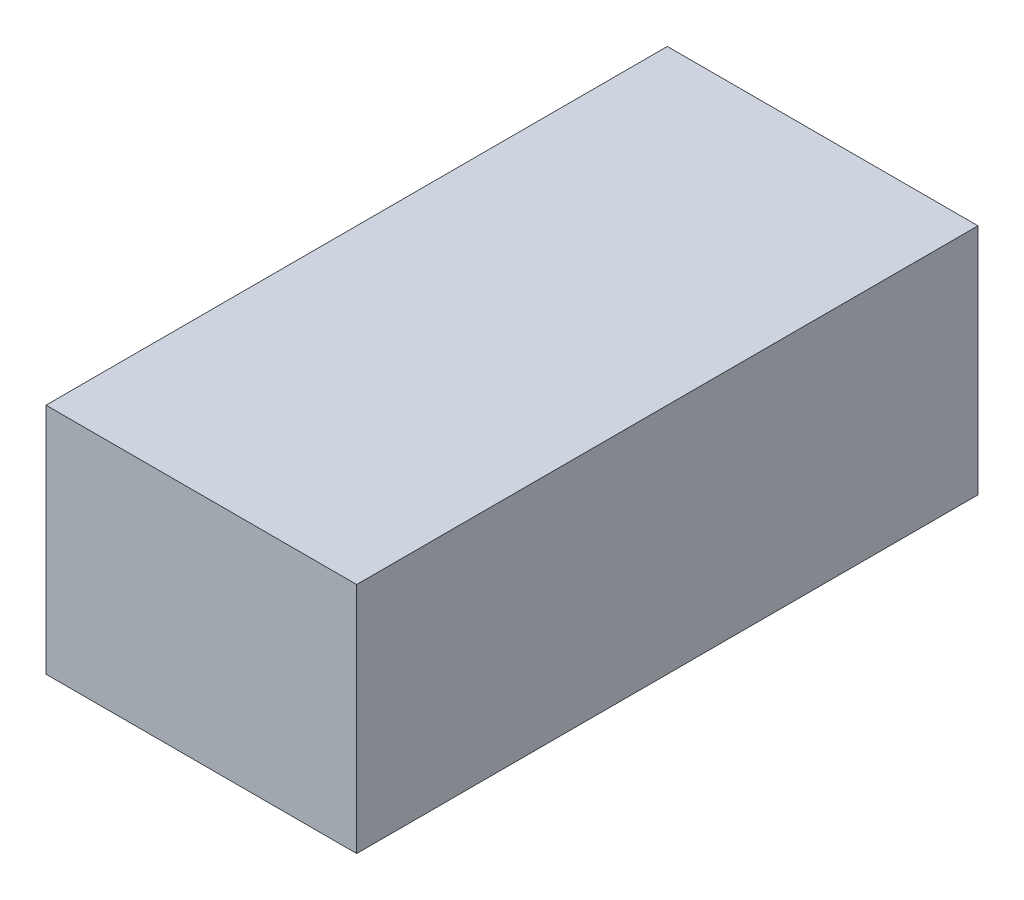
ISO-10303-21;
HEADER;
FILE_DESCRIPTION(('STEP AP214'),'2;1');
FILE_NAME('part.step','',(''),(''),'','','');
FILE_SCHEMA(('AUTOMOTIVE_DESIGN { 1 0 10303 214 1 1 1 1 }'));
ENDSEC;
DATA;
#1=APPLICATION_CONTEXT('core data for automotive mechanical design processes');
#2=APPLICATION_PROTOCOL_DEFINITION('international standard','automotive_design',2000,#1);
#3=PRODUCT_CONTEXT('',#1,'mechanical');
#4=PRODUCT('Part','Part','',(#3));
#5=PRODUCT_RELATED_PRODUCT_CATEGORY('part','',(#4));
#6=PRODUCT_DEFINITION_FORMATION('','',#4);
#7=PRODUCT_DEFINITION_CONTEXT('part definition',#1,'design');
#8=PRODUCT_DEFINITION('design','',#6,#7);
#9=PRODUCT_DEFINITION_SHAPE('','',#8);
#10=(LENGTH_UNIT() NAMED_UNIT(*) SI_UNIT(.MILLI.,.METRE.));
#11=(NAMED_UNIT(*) PLANE_ANGLE_UNIT() SI_UNIT($,.RADIAN.));
#12=(NAMED_UNIT(*) SI_UNIT($,.STERADIAN.) SOLID_ANGLE_UNIT());
#13=UNCERTAINTY_MEASURE_WITH_UNIT(LENGTH_MEASURE(1.E-05),#10,'distance_accuracy_value','');
#14=(GEOMETRIC_REPRESENTATION_CONTEXT(3) GLOBAL_UNCERTAINTY_ASSIGNED_CONTEXT((#13)) GLOBAL_UNIT_ASSIGNED_CONTEXT((#10,
#11,#12)) REPRESENTATION_CONTEXT('',''));
#15=CARTESIAN_POINT('',(0.,0.,0.));
#16=DIRECTION('',(0.,0.,1.));
#17=DIRECTION('',(1.,0.,0.));
#18=AXIS2_PLACEMENT_3D('',#15,#16,#17);
#19=CARTESIAN_POINT('',(50.,75.,-100.));
#20=DIRECTION('',(-1.,0.,0.));
#21=DIRECTION('',(0.,0.,1.));
#22=AXIS2_PLACEMENT_3D('',#19,#20,#21);
#23=PLANE('',#22);
#24=DIRECTION('',(0.,0.,-1.));
#25=VECTOR('',#24,1.);
#26=CARTESIAN_POINT('',(50.,0.,-100.));
#27=LINE('',#26,#25);
#28=CARTESIAN_POINT('',(50.,0.,100.));
#29=VERTEX_POINT('',#28);
#30=CARTESIAN_POINT('',(50.,0.,-100.));
#31=VERTEX_POINT('',#30);
#32=EDGE_CURVE('E108',#29,#31,#27,.T.);
#33=ORIENTED_EDGE('',*,*,#32,.T.);
#34=DIRECTION('',(0.,-1.,0.));
#35=VECTOR('',#34,1.);
#36=CARTESIAN_POINT('',(50.,75.,-100.));
#37=LINE('',#36,#35);
#38=CARTESIAN_POINT('',(50.,75.,-100.));
#39=VERTEX_POINT('',#38);
#40=EDGE_CURVE('E11',#39,#31,#37,.T.);
#41=ORIENTED_EDGE('',*,*,#40,.F.);
#42=DIRECTION('',(0.,0.,-1.));
#43=VECTOR('',#42,1.);
#44=CARTESIAN_POINT('',(50.,75.,-100.));
#45=LINE('',#44,#43);
#46=CARTESIAN_POINT('',(50.,75.,100.));
#47=VERTEX_POINT('',#46);
#48=EDGE_CURVE('E96',#47,#39,#45,.T.);
#49=ORIENTED_EDGE('',*,*,#48,.F.);
#50=DIRECTION('',(0.,-1.,0.));
#51=VECTOR('',#50,1.);
#52=CARTESIAN_POINT('',(50.,75.,100.));
#53=LINE('',#52,#51);
#54=EDGE_CURVE('E104',#47,#29,#53,.T.);
#55=ORIENTED_EDGE('',*,*,#54,.T.);
#56=EDGE_LOOP('',(#33,#41,#49,#55));
#57=FACE_BOUND('',#56,.T.);
#58=ADVANCED_FACE('F45',(#57),#23,.F.);
#59=CARTESIAN_POINT('',(-50.,75.,-100.));
#60=DIRECTION('',(0.,0.,1.));
#61=DIRECTION('',(1.,0.,0.));
#62=AXIS2_PLACEMENT_3D('',#59,#60,#61);
#63=PLANE('',#62);
#64=DIRECTION('',(-1.,0.,0.));
#65=VECTOR('',#64,1.);
#66=CARTESIAN_POINT('',(-50.,0.,-100.));
#67=LINE('',#66,#65);
#68=CARTESIAN_POINT('',(-50.,0.,-100.));
#69=VERTEX_POINT('',#68);
#70=EDGE_CURVE('E100',#31,#69,#67,.T.);
#71=ORIENTED_EDGE('',*,*,#70,.T.);
#72=DIRECTION('',(0.,-1.,0.));
#73=VECTOR('',#72,1.);
#74=CARTESIAN_POINT('',(-50.,75.,-100.));
#75=LINE('',#74,#73);
#76=CARTESIAN_POINT('',(-50.,75.,-100.));
#77=VERTEX_POINT('',#76);
#78=EDGE_CURVE('E53',#77,#69,#75,.T.);
#79=ORIENTED_EDGE('',*,*,#78,.F.);
#80=DIRECTION('',(-1.,0.,0.));
#81=VECTOR('',#80,1.);
#82=CARTESIAN_POINT('',(-50.,75.,-100.));
#83=LINE('',#82,#81);
#84=EDGE_CURVE('E91',#39,#77,#83,.T.);
#85=ORIENTED_EDGE('',*,*,#84,.F.);
#86=ORIENTED_EDGE('',*,*,#40,.T.);
#87=EDGE_LOOP('',(#71,#79,#85,#86));
#88=FACE_BOUND('',#87,.T.);
#89=ADVANCED_FACE('F99',(#88),#63,.F.);
#90=CARTESIAN_POINT('',(-50.,75.,-100.));
#91=DIRECTION('',(1.,0.,0.));
#92=DIRECTION('',(0.,0.,-1.));
#93=AXIS2_PLACEMENT_3D('',#90,#91,#92);
#94=PLANE('',#93);
#95=DIRECTION('',(0.,0.,1.));
#96=VECTOR('',#95,1.);
#97=CARTESIAN_POINT('',(-50.,0.,-100.));
#98=LINE('',#97,#96);
#99=CARTESIAN_POINT('',(-50.,0.,100.));
#100=VERTEX_POINT('',#99);
#101=EDGE_CURVE('E78',#69,#100,#98,.T.);
#102=ORIENTED_EDGE('',*,*,#101,.T.);
#103=DIRECTION('',(0.,-1.,0.));
#104=VECTOR('',#103,1.);
#105=CARTESIAN_POINT('',(-50.,75.,100.));
#106=LINE('',#105,#104);
#107=CARTESIAN_POINT('',(-50.,75.,100.));
#108=VERTEX_POINT('',#107);
#109=EDGE_CURVE('E101',#108,#100,#106,.T.);
#110=ORIENTED_EDGE('',*,*,#109,.F.);
#111=DIRECTION('',(0.,0.,1.));
#112=VECTOR('',#111,1.);
#113=CARTESIAN_POINT('',(-50.,75.,-100.));
#114=LINE('',#113,#112);
#115=EDGE_CURVE('E94',#77,#108,#114,.T.);
#116=ORIENTED_EDGE('',*,*,#115,.F.);
#117=ORIENTED_EDGE('',*,*,#78,.T.);
#118=EDGE_LOOP('',(#102,#110,#116,#117));
#119=FACE_BOUND('',#118,.T.);
#120=ADVANCED_FACE('F102',(#119),#94,.F.);
#121=CARTESIAN_POINT('',(-50.,75.,100.));
#122=DIRECTION('',(0.,0.,-1.));
#123=DIRECTION('',(-1.,0.,0.));
#124=AXIS2_PLACEMENT_3D('',#121,#122,#123);
#125=PLANE('',#124);
#126=DIRECTION('',(1.,0.,0.));
#127=VECTOR('',#126,1.);
#128=CARTESIAN_POINT('',(-50.,0.,100.));
#129=LINE('',#128,#127);
#130=EDGE_CURVE('E84',#100,#29,#129,.T.);
#131=ORIENTED_EDGE('',*,*,#130,.T.);
#132=ORIENTED_EDGE('',*,*,#54,.F.);
#133=DIRECTION('',(1.,0.,0.));
#134=VECTOR('',#133,1.);
#135=CARTESIAN_POINT('',(-50.,75.,100.));
#136=LINE('',#135,#134);
#137=EDGE_CURVE('E61',#108,#47,#136,.T.);
#138=ORIENTED_EDGE('',*,*,#137,.F.);
#139=ORIENTED_EDGE('',*,*,#109,.T.);
#140=EDGE_LOOP('',(#131,#132,#138,#139));
#141=FACE_BOUND('',#140,.T.);
#142=ADVANCED_FACE('F115',(#141),#125,.F.);
#143=CARTESIAN_POINT('',(0.,75.,0.));
#144=DIRECTION('',(0.,1.,0.));
#145=DIRECTION('',(0.,0.,1.));
#146=AXIS2_PLACEMENT_3D('',#143,#144,#145);
#147=PLANE('',#146);
#148=ORIENTED_EDGE('',*,*,#48,.T.);
#149=ORIENTED_EDGE('',*,*,#84,.T.);
#150=ORIENTED_EDGE('',*,*,#115,.T.);
#151=ORIENTED_EDGE('',*,*,#137,.T.);
#152=EDGE_LOOP('',(#148,#149,#150,#151));
#153=FACE_BOUND('',#152,.T.);
#154=ADVANCED_FACE('F92',(#153),#147,.T.);
#155=CARTESIAN_POINT('',(0.,0.,0.));
#156=DIRECTION('',(0.,1.,0.));
#157=DIRECTION('',(0.,0.,1.));
#158=AXIS2_PLACEMENT_3D('',#155,#156,#157);
#159=PLANE('',#158);
#160=ORIENTED_EDGE('',*,*,#32,.F.);
#161=ORIENTED_EDGE('',*,*,#130,.F.);
#162=ORIENTED_EDGE('',*,*,#101,.F.);
#163=ORIENTED_EDGE('',*,*,#70,.F.);
#164=EDGE_LOOP('',(#160,#161,#162,#163));
#165=FACE_BOUND('',#164,.T.);
#166=ADVANCED_FACE('F118',(#165),#159,.F.);
#167=CLOSED_SHELL('',(#58,#89,#120,#142,#154,#166));
#168=MANIFOLD_SOLID_BREP('B2',#167);
#169=ADVANCED_BREP_SHAPE_REPRESENTATION('',(#18,#168),#14);
#170=SHAPE_DEFINITION_REPRESENTATION(#9,#169);
ENDSEC;
END-ISO-10303-21;
